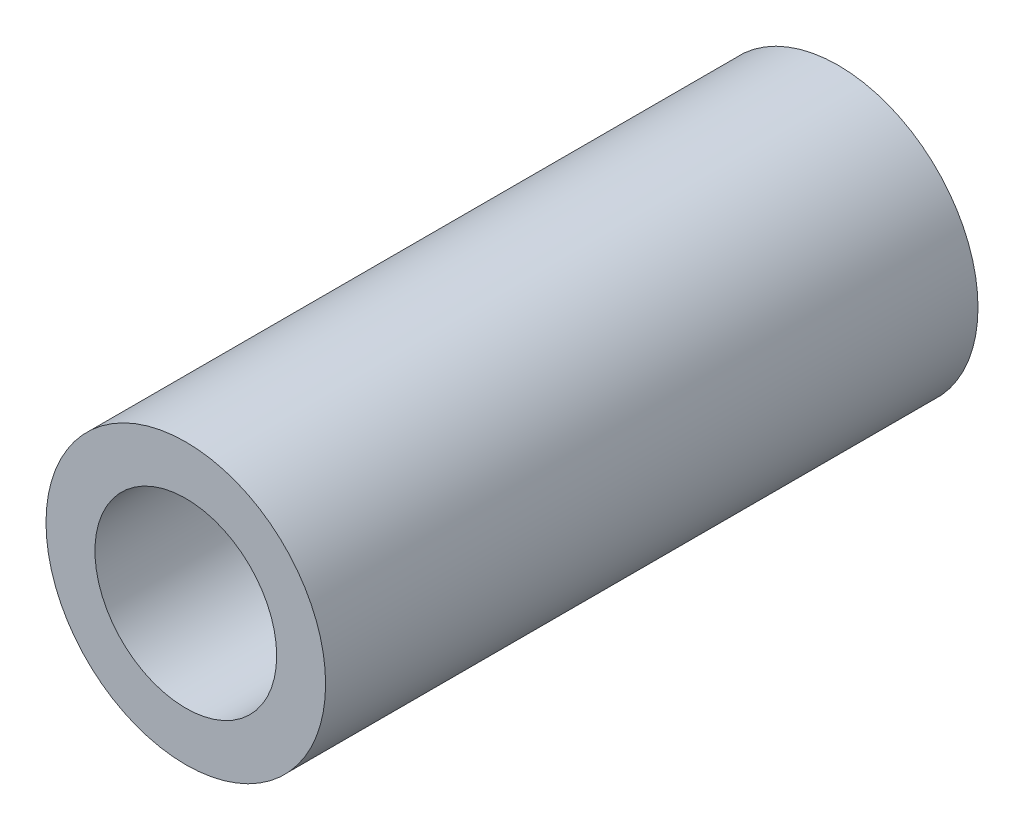
ISO-10303-21;
HEADER;
FILE_DESCRIPTION(('STEP AP214'),'2;1');
FILE_NAME('part.step','',(''),(''),'','','');
FILE_SCHEMA(('AUTOMOTIVE_DESIGN { 1 0 10303 214 1 1 1 1 }'));
ENDSEC;
DATA;
#1=APPLICATION_CONTEXT('core data for automotive mechanical design processes');
#2=APPLICATION_PROTOCOL_DEFINITION('international standard','automotive_design',2000,#1);
#3=PRODUCT_CONTEXT('',#1,'mechanical');
#4=PRODUCT('Part','Part','',(#3));
#5=PRODUCT_RELATED_PRODUCT_CATEGORY('part','',(#4));
#6=PRODUCT_DEFINITION_FORMATION('','',#4);
#7=PRODUCT_DEFINITION_CONTEXT('part definition',#1,'design');
#8=PRODUCT_DEFINITION('design','',#6,#7);
#9=PRODUCT_DEFINITION_SHAPE('','',#8);
#10=(LENGTH_UNIT() NAMED_UNIT(*) SI_UNIT(.MILLI.,.METRE.));
#11=(NAMED_UNIT(*) PLANE_ANGLE_UNIT() SI_UNIT($,.RADIAN.));
#12=(NAMED_UNIT(*) SI_UNIT($,.STERADIAN.) SOLID_ANGLE_UNIT());
#13=UNCERTAINTY_MEASURE_WITH_UNIT(LENGTH_MEASURE(1.E-05),#10,'distance_accuracy_value','');
#14=(GEOMETRIC_REPRESENTATION_CONTEXT(3) GLOBAL_UNCERTAINTY_ASSIGNED_CONTEXT((#13)) GLOBAL_UNIT_ASSIGNED_CONTEXT((#10,
#11,#12)) REPRESENTATION_CONTEXT('',''));
#15=CARTESIAN_POINT('',(0.,0.,0.));
#16=DIRECTION('',(0.,0.,1.));
#17=DIRECTION('',(1.,0.,0.));
#18=AXIS2_PLACEMENT_3D('',#15,#16,#17);
#19=CARTESIAN_POINT('',(0.,0.,16.));
#20=DIRECTION('',(0.,0.,-1.));
#21=DIRECTION('',(-1.,0.,0.));
#22=AXIS2_PLACEMENT_3D('',#19,#20,#21);
#23=CYLINDRICAL_SURFACE('',#22,4.05);
#24=CARTESIAN_POINT('',(0.,0.,0.));
#25=DIRECTION('',(0.,0.,-1.));
#26=DIRECTION('',(-1.,0.,0.));
#27=AXIS2_PLACEMENT_3D('',#24,#25,#26);
#28=CIRCLE('',#27,4.05);
#29=CARTESIAN_POINT('',(-4.05,0.,0.));
#30=VERTEX_POINT('',#29);
#31=EDGE_CURVE('E80',#30,#30,#28,.T.);
#32=ORIENTED_EDGE('',*,*,#31,.T.);
#33=EDGE_LOOP('',(#32));
#34=FACE_BOUND('',#33,.T.);
#35=DIRECTION('',(0.,0.,1.));
#36=VECTOR('',#35,1.);
#37=CARTESIAN_POINT('',(-2.82204176173807,-2.90492345768461,7.));
#38=LINE('',#37,#36);
#39=CARTESIAN_POINT('',(-2.82204176173807,-2.90492345768461,7.));
#40=VERTEX_POINT('',#39);
#41=CARTESIAN_POINT('',(-2.82204176173807,-2.90492345768461,16.));
#42=VERTEX_POINT('',#41);
#43=EDGE_CURVE('E54',#40,#42,#38,.T.);
#44=ORIENTED_EDGE('',*,*,#43,.F.);
#45=CARTESIAN_POINT('',(0.,0.,7.));
#46=DIRECTION('',(0.,0.,-1.));
#47=DIRECTION('',(1.,0.,0.));
#48=AXIS2_PLACEMENT_3D('',#45,#46,#47);
#49=CIRCLE('',#48,4.05);
#50=CARTESIAN_POINT('',(3.20049633833379,-2.48179837785263,7.));
#51=VERTEX_POINT('',#50);
#52=EDGE_CURVE('E73',#51,#40,#49,.T.);
#53=ORIENTED_EDGE('',*,*,#52,.F.);
#54=DIRECTION('',(0.,0.,1.));
#55=VECTOR('',#54,1.);
#56=CARTESIAN_POINT('',(3.20049633833379,-2.48179837785263,7.));
#57=LINE('',#56,#55);
#58=CARTESIAN_POINT('',(3.20049633833379,-2.48179837785263,16.));
#59=VERTEX_POINT('',#58);
#60=EDGE_CURVE('E68',#51,#59,#57,.T.);
#61=ORIENTED_EDGE('',*,*,#60,.T.);
#62=CARTESIAN_POINT('',(0.,0.,16.));
#63=DIRECTION('',(0.,0.,-1.));
#64=DIRECTION('',(-1.,0.,0.));
#65=AXIS2_PLACEMENT_3D('',#62,#63,#64);
#66=CIRCLE('',#65,4.05);
#67=EDGE_CURVE('E76',#42,#59,#66,.T.);
#68=ORIENTED_EDGE('',*,*,#67,.F.);
#69=EDGE_LOOP('',(#44,#53,#61,#68));
#70=FACE_BOUND('',#69,.T.);
#71=ADVANCED_FACE('F39',(#34,#70),#23,.F.);
#72=CARTESIAN_POINT('',(0.,0.,16.));
#73=DIRECTION('',(0.,0.,-1.));
#74=DIRECTION('',(-1.,0.,0.));
#75=AXIS2_PLACEMENT_3D('',#72,#73,#74);
#76=PLANE('',#75);
#77=ORIENTED_EDGE('',*,*,#67,.T.);
#78=DIRECTION('',(0.997541080655045,0.0700841808510609,0.));
#79=VECTOR('',#78,1.);
#80=CARTESIAN_POINT('',(-2.82204176173807,-2.90492345768461,16.));
#81=LINE('',#80,#79);
#82=EDGE_CURVE('E65',#42,#59,#81,.T.);
#83=ORIENTED_EDGE('',*,*,#82,.F.);
#84=EDGE_LOOP('',(#77,#83));
#85=FACE_BOUND('',#84,.T.);
#86=ADVANCED_FACE('F78',(#85),#76,.T.);
#87=CARTESIAN_POINT('',(0.,0.,35.));
#88=DIRECTION('',(0.,0.,-1.));
#89=DIRECTION('',(-1.,0.,0.));
#90=AXIS2_PLACEMENT_3D('',#87,#88,#89);
#91=CYLINDRICAL_SURFACE('',#90,7.5);
#92=CARTESIAN_POINT('',(0.,0.,35.));
#93=DIRECTION('',(0.,0.,1.));
#94=DIRECTION('',(1.,0.,0.));
#95=AXIS2_PLACEMENT_3D('',#92,#93,#94);
#96=CIRCLE('',#95,7.5);
#97=CARTESIAN_POINT('',(7.5,0.,35.));
#98=VERTEX_POINT('',#97);
#99=EDGE_CURVE('E11',#98,#98,#96,.T.);
#100=ORIENTED_EDGE('',*,*,#99,.F.);
#101=EDGE_LOOP('',(#100));
#102=FACE_BOUND('',#101,.T.);
#103=CARTESIAN_POINT('',(0.,0.,0.));
#104=DIRECTION('',(0.,0.,1.));
#105=DIRECTION('',(1.,0.,0.));
#106=AXIS2_PLACEMENT_3D('',#103,#104,#105);
#107=CIRCLE('',#106,7.5);
#108=CARTESIAN_POINT('',(7.5,0.,0.));
#109=VERTEX_POINT('',#108);
#110=EDGE_CURVE('E43',#109,#109,#107,.T.);
#111=ORIENTED_EDGE('',*,*,#110,.T.);
#112=EDGE_LOOP('',(#111));
#113=FACE_BOUND('',#112,.T.);
#114=ADVANCED_FACE('F41',(#102,#113),#91,.T.);
#115=CARTESIAN_POINT('',(0.,0.,35.));
#116=DIRECTION('',(0.,0.,1.));
#117=DIRECTION('',(1.,0.,0.));
#118=AXIS2_PLACEMENT_3D('',#115,#116,#117);
#119=PLANE('',#118);
#120=CARTESIAN_POINT('',(0.,0.,35.));
#121=DIRECTION('',(0.,0.,1.));
#122=DIRECTION('',(1.,0.,0.));
#123=AXIS2_PLACEMENT_3D('',#120,#121,#122);
#124=CIRCLE('',#123,4.875);
#125=CARTESIAN_POINT('',(4.875,0.,35.));
#126=VERTEX_POINT('',#125);
#127=EDGE_CURVE('E79',#126,#126,#124,.T.);
#128=ORIENTED_EDGE('',*,*,#127,.F.);
#129=EDGE_LOOP('',(#128));
#130=FACE_BOUND('',#129,.T.);
#131=ORIENTED_EDGE('',*,*,#99,.T.);
#132=EDGE_LOOP('',(#131));
#133=FACE_BOUND('',#132,.T.);
#134=ADVANCED_FACE('F99',(#130,#133),#119,.T.);
#135=CARTESIAN_POINT('',(0.,0.,0.));
#136=DIRECTION('',(0.,0.,1.));
#137=DIRECTION('',(1.,0.,0.));
#138=AXIS2_PLACEMENT_3D('',#135,#136,#137);
#139=PLANE('',#138);
#140=ORIENTED_EDGE('',*,*,#31,.F.);
#141=EDGE_LOOP('',(#140));
#142=FACE_BOUND('',#141,.T.);
#143=ORIENTED_EDGE('',*,*,#110,.F.);
#144=EDGE_LOOP('',(#143));
#145=FACE_BOUND('',#144,.T.);
#146=ADVANCED_FACE('F96',(#142,#145),#139,.F.);
#147=CARTESIAN_POINT('',(0.,0.,19.));
#148=DIRECTION('',(0.,0.,1.));
#149=DIRECTION('',(1.,0.,0.));
#150=AXIS2_PLACEMENT_3D('',#147,#148,#149);
#151=CYLINDRICAL_SURFACE('',#150,4.875);
#152=CARTESIAN_POINT('',(0.,0.,19.));
#153=DIRECTION('',(0.,0.,1.));
#154=DIRECTION('',(1.,0.,0.));
#155=AXIS2_PLACEMENT_3D('',#152,#153,#154);
#156=CIRCLE('',#155,4.875);
#157=CARTESIAN_POINT('',(4.875,0.,19.));
#158=VERTEX_POINT('',#157);
#159=EDGE_CURVE('E83',#158,#158,#156,.T.);
#160=ORIENTED_EDGE('',*,*,#159,.F.);
#161=EDGE_LOOP('',(#160));
#162=FACE_BOUND('',#161,.T.);
#163=ORIENTED_EDGE('',*,*,#127,.T.);
#164=EDGE_LOOP('',(#163));
#165=FACE_BOUND('',#164,.T.);
#166=ADVANCED_FACE('F98',(#162,#165),#151,.F.);
#167=CARTESIAN_POINT('',(0.,0.,19.));
#168=DIRECTION('',(0.,0.,1.));
#169=DIRECTION('',(1.,0.,0.));
#170=AXIS2_PLACEMENT_3D('',#167,#168,#169);
#171=PLANE('',#170);
#172=ORIENTED_EDGE('',*,*,#159,.T.);
#173=EDGE_LOOP('',(#172));
#174=FACE_BOUND('',#173,.T.);
#175=ADVANCED_FACE('F106',(#174),#171,.T.);
#176=CARTESIAN_POINT('',(-2.82204176173807,-2.90492345768461,7.));
#177=DIRECTION('',(0.0700841808510609,-0.997541080655045,0.));
#178=DIRECTION('',(0.997541080655046,0.0700841808510609,0.));
#179=AXIS2_PLACEMENT_3D('',#176,#177,#178);
#180=PLANE('',#179);
#181=ORIENTED_EDGE('',*,*,#82,.T.);
#182=ORIENTED_EDGE('',*,*,#60,.F.);
#183=DIRECTION('',(0.997541080655045,0.0700841808510609,0.));
#184=VECTOR('',#183,1.);
#185=CARTESIAN_POINT('',(-2.82204176173807,-2.90492345768461,7.));
#186=LINE('',#185,#184);
#187=EDGE_CURVE('E61',#40,#51,#186,.T.);
#188=ORIENTED_EDGE('',*,*,#187,.F.);
#189=ORIENTED_EDGE('',*,*,#43,.T.);
#190=EDGE_LOOP('',(#181,#182,#188,#189));
#191=FACE_BOUND('',#190,.T.);
#192=ADVANCED_FACE('F67',(#191),#180,.F.);
#193=CARTESIAN_POINT('',(0.,0.,7.));
#194=DIRECTION('',(0.,0.,1.));
#195=DIRECTION('',(1.,0.,0.));
#196=AXIS2_PLACEMENT_3D('',#193,#194,#195);
#197=PLANE('',#196);
#198=ORIENTED_EDGE('',*,*,#52,.T.);
#199=ORIENTED_EDGE('',*,*,#187,.T.);
#200=EDGE_LOOP('',(#198,#199));
#201=FACE_BOUND('',#200,.T.);
#202=ADVANCED_FACE('F124',(#201),#197,.F.);
#203=CLOSED_SHELL('',(#71,#86,#114,#134,#146,#166,#175,#192,#202));
#204=MANIFOLD_SOLID_BREP('B2',#203);
#205=ADVANCED_BREP_SHAPE_REPRESENTATION('',(#18,#204),#14);
#206=SHAPE_DEFINITION_REPRESENTATION(#9,#205);
ENDSEC;
END-ISO-10303-21;
